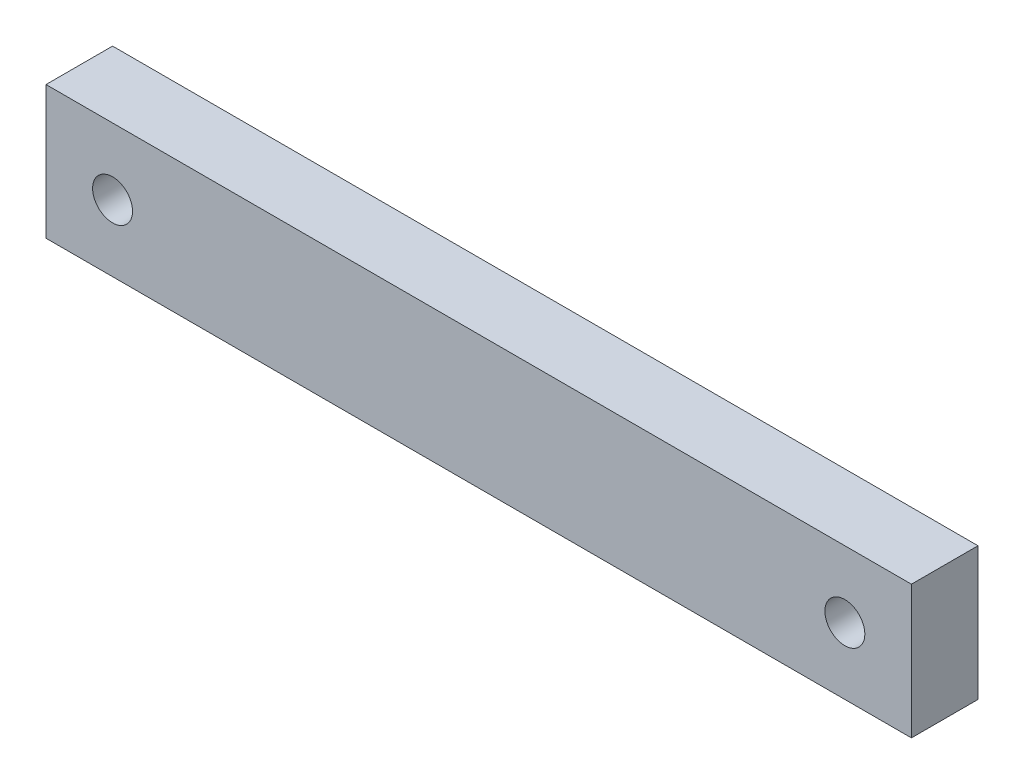
ISO-10303-21;
HEADER;
FILE_DESCRIPTION(('STEP AP214'),'2;1');
FILE_NAME('part.step','',(''),(''),'','','');
FILE_SCHEMA(('AUTOMOTIVE_DESIGN { 1 0 10303 214 1 1 1 1 }'));
ENDSEC;
DATA;
#1=APPLICATION_CONTEXT('core data for automotive mechanical design processes');
#2=APPLICATION_PROTOCOL_DEFINITION('international standard','automotive_design',2000,#1);
#3=PRODUCT_CONTEXT('',#1,'mechanical');
#4=PRODUCT('Part','Part','',(#3));
#5=PRODUCT_RELATED_PRODUCT_CATEGORY('part','',(#4));
#6=PRODUCT_DEFINITION_FORMATION('','',#4);
#7=PRODUCT_DEFINITION_CONTEXT('part definition',#1,'design');
#8=PRODUCT_DEFINITION('design','',#6,#7);
#9=PRODUCT_DEFINITION_SHAPE('','',#8);
#10=(LENGTH_UNIT() NAMED_UNIT(*) SI_UNIT(.MILLI.,.METRE.));
#11=(NAMED_UNIT(*) PLANE_ANGLE_UNIT() SI_UNIT($,.RADIAN.));
#12=(NAMED_UNIT(*) SI_UNIT($,.STERADIAN.) SOLID_ANGLE_UNIT());
#13=UNCERTAINTY_MEASURE_WITH_UNIT(LENGTH_MEASURE(1.E-05),#10,'distance_accuracy_value','');
#14=(GEOMETRIC_REPRESENTATION_CONTEXT(3) GLOBAL_UNCERTAINTY_ASSIGNED_CONTEXT((#13)) GLOBAL_UNIT_ASSIGNED_CONTEXT((#10,
#11,#12)) REPRESENTATION_CONTEXT('',''));
#15=CARTESIAN_POINT('',(0.,0.,0.));
#16=DIRECTION('',(0.,0.,1.));
#17=DIRECTION('',(1.,0.,0.));
#18=AXIS2_PLACEMENT_3D('',#15,#16,#17);
#19=CARTESIAN_POINT('',(0.,0.,5.));
#20=DIRECTION('',(0.,0.,-1.));
#21=DIRECTION('',(-1.,0.,0.));
#22=AXIS2_PLACEMENT_3D('',#19,#20,#21);
#23=PLANE('',#22);
#24=DIRECTION('',(1.,0.,0.));
#25=VECTOR('',#24,1.);
#26=CARTESIAN_POINT('',(-32.5,-5.,5.));
#27=LINE('',#26,#25);
#28=CARTESIAN_POINT('',(-32.5,-5.,5.));
#29=VERTEX_POINT('',#28);
#30=CARTESIAN_POINT('',(32.5,-5.,5.));
#31=VERTEX_POINT('',#30);
#32=EDGE_CURVE('E116',#29,#31,#27,.T.);
#33=ORIENTED_EDGE('',*,*,#32,.T.);
#34=DIRECTION('',(0.,-1.,0.));
#35=VECTOR('',#34,1.);
#36=CARTESIAN_POINT('',(32.5,5.,5.));
#37=LINE('',#36,#35);
#38=CARTESIAN_POINT('',(32.5,5.,5.));
#39=VERTEX_POINT('',#38);
#40=EDGE_CURVE('E123',#39,#31,#37,.T.);
#41=ORIENTED_EDGE('',*,*,#40,.F.);
#42=DIRECTION('',(1.,0.,0.));
#43=VECTOR('',#42,1.);
#44=CARTESIAN_POINT('',(-32.5,5.,5.));
#45=LINE('',#44,#43);
#46=CARTESIAN_POINT('',(-32.5,5.,5.));
#47=VERTEX_POINT('',#46);
#48=EDGE_CURVE('E132',#47,#39,#45,.T.);
#49=ORIENTED_EDGE('',*,*,#48,.F.);
#50=DIRECTION('',(0.,-1.,0.));
#51=VECTOR('',#50,1.);
#52=CARTESIAN_POINT('',(-32.5,5.,5.));
#53=LINE('',#52,#51);
#54=EDGE_CURVE('E93',#47,#29,#53,.T.);
#55=ORIENTED_EDGE('',*,*,#54,.T.);
#56=EDGE_LOOP('',(#33,#41,#49,#55));
#57=FACE_BOUND('',#56,.T.);
#58=CARTESIAN_POINT('',(-27.5,0.,5.));
#59=DIRECTION('',(0.,0.,1.));
#60=DIRECTION('',(1.,0.,0.));
#61=AXIS2_PLACEMENT_3D('',#58,#59,#60);
#62=CIRCLE('',#61,1.5);
#63=CARTESIAN_POINT('',(-26.,0.,5.));
#64=VERTEX_POINT('',#63);
#65=EDGE_CURVE('E147',#64,#64,#62,.T.);
#66=ORIENTED_EDGE('',*,*,#65,.F.);
#67=EDGE_LOOP('',(#66));
#68=FACE_BOUND('',#67,.T.);
#69=CARTESIAN_POINT('',(27.5,0.,5.));
#70=DIRECTION('',(0.,0.,1.));
#71=DIRECTION('',(1.,0.,0.));
#72=AXIS2_PLACEMENT_3D('',#69,#70,#71);
#73=CIRCLE('',#72,1.5);
#74=CARTESIAN_POINT('',(29.,0.,5.));
#75=VERTEX_POINT('',#74);
#76=EDGE_CURVE('E171',#75,#75,#73,.T.);
#77=ORIENTED_EDGE('',*,*,#76,.F.);
#78=EDGE_LOOP('',(#77));
#79=FACE_BOUND('',#78,.T.);
#80=ADVANCED_FACE('F75',(#57,#68,#79),#23,.F.);
#81=CARTESIAN_POINT('',(0.,0.,0.));
#82=DIRECTION('',(0.,0.,-1.));
#83=DIRECTION('',(-1.,0.,0.));
#84=AXIS2_PLACEMENT_3D('',#81,#82,#83);
#85=PLANE('',#84);
#86=CARTESIAN_POINT('',(-27.5,0.,0.));
#87=DIRECTION('',(0.,0.,1.));
#88=DIRECTION('',(1.,0.,0.));
#89=AXIS2_PLACEMENT_3D('',#86,#87,#88);
#90=CIRCLE('',#89,1.5);
#91=CARTESIAN_POINT('',(-26.,0.,0.));
#92=VERTEX_POINT('',#91);
#93=EDGE_CURVE('E175',#92,#92,#90,.T.);
#94=ORIENTED_EDGE('',*,*,#93,.T.);
#95=EDGE_LOOP('',(#94));
#96=FACE_BOUND('',#95,.T.);
#97=DIRECTION('',(1.,0.,0.));
#98=VECTOR('',#97,1.);
#99=CARTESIAN_POINT('',(-32.5,-5.,0.));
#100=LINE('',#99,#98);
#101=CARTESIAN_POINT('',(-32.5,-5.,0.));
#102=VERTEX_POINT('',#101);
#103=CARTESIAN_POINT('',(32.5,-5.,0.));
#104=VERTEX_POINT('',#103);
#105=EDGE_CURVE('E143',#102,#104,#100,.T.);
#106=ORIENTED_EDGE('',*,*,#105,.F.);
#107=DIRECTION('',(0.,-1.,0.));
#108=VECTOR('',#107,1.);
#109=CARTESIAN_POINT('',(-32.5,5.,0.));
#110=LINE('',#109,#108);
#111=CARTESIAN_POINT('',(-32.5,5.,0.));
#112=VERTEX_POINT('',#111);
#113=EDGE_CURVE('E111',#112,#102,#110,.T.);
#114=ORIENTED_EDGE('',*,*,#113,.F.);
#115=DIRECTION('',(1.,0.,0.));
#116=VECTOR('',#115,1.);
#117=CARTESIAN_POINT('',(-32.5,5.,0.));
#118=LINE('',#117,#116);
#119=CARTESIAN_POINT('',(32.5,5.,0.));
#120=VERTEX_POINT('',#119);
#121=EDGE_CURVE('E150',#112,#120,#118,.T.);
#122=ORIENTED_EDGE('',*,*,#121,.T.);
#123=DIRECTION('',(0.,-1.,0.));
#124=VECTOR('',#123,1.);
#125=CARTESIAN_POINT('',(32.5,5.,0.));
#126=LINE('',#125,#124);
#127=EDGE_CURVE('E125',#120,#104,#126,.T.);
#128=ORIENTED_EDGE('',*,*,#127,.T.);
#129=EDGE_LOOP('',(#106,#114,#122,#128));
#130=FACE_BOUND('',#129,.T.);
#131=CARTESIAN_POINT('',(27.5,0.,0.));
#132=DIRECTION('',(0.,0.,1.));
#133=DIRECTION('',(1.,0.,0.));
#134=AXIS2_PLACEMENT_3D('',#131,#132,#133);
#135=CIRCLE('',#134,1.5);
#136=CARTESIAN_POINT('',(29.,0.,0.));
#137=VERTEX_POINT('',#136);
#138=EDGE_CURVE('E168',#137,#137,#135,.T.);
#139=ORIENTED_EDGE('',*,*,#138,.T.);
#140=EDGE_LOOP('',(#139));
#141=FACE_BOUND('',#140,.T.);
#142=ADVANCED_FACE('F161',(#96,#130,#141),#85,.T.);
#143=CARTESIAN_POINT('',(-32.5,-5.,5.));
#144=DIRECTION('',(0.,1.,0.));
#145=DIRECTION('',(0.,0.,1.));
#146=AXIS2_PLACEMENT_3D('',#143,#144,#145);
#147=PLANE('',#146);
#148=ORIENTED_EDGE('',*,*,#105,.T.);
#149=DIRECTION('',(0.,0.,-1.));
#150=VECTOR('',#149,1.);
#151=CARTESIAN_POINT('',(32.5,-5.,5.));
#152=LINE('',#151,#150);
#153=EDGE_CURVE('E12',#31,#104,#152,.T.);
#154=ORIENTED_EDGE('',*,*,#153,.F.);
#155=ORIENTED_EDGE('',*,*,#32,.F.);
#156=DIRECTION('',(0.,0.,-1.));
#157=VECTOR('',#156,1.);
#158=CARTESIAN_POINT('',(-32.5,-5.,5.));
#159=LINE('',#158,#157);
#160=EDGE_CURVE('E139',#29,#102,#159,.T.);
#161=ORIENTED_EDGE('',*,*,#160,.T.);
#162=EDGE_LOOP('',(#148,#154,#155,#161));
#163=FACE_BOUND('',#162,.T.);
#164=ADVANCED_FACE('F77',(#163),#147,.F.);
#165=CARTESIAN_POINT('',(32.5,5.,5.));
#166=DIRECTION('',(1.,0.,0.));
#167=DIRECTION('',(0.,0.,-1.));
#168=AXIS2_PLACEMENT_3D('',#165,#166,#167);
#169=PLANE('',#168);
#170=ORIENTED_EDGE('',*,*,#127,.F.);
#171=DIRECTION('',(0.,0.,-1.));
#172=VECTOR('',#171,1.);
#173=CARTESIAN_POINT('',(32.5,5.,5.));
#174=LINE('',#173,#172);
#175=EDGE_CURVE('E85',#39,#120,#174,.T.);
#176=ORIENTED_EDGE('',*,*,#175,.F.);
#177=ORIENTED_EDGE('',*,*,#40,.T.);
#178=ORIENTED_EDGE('',*,*,#153,.T.);
#179=EDGE_LOOP('',(#170,#176,#177,#178));
#180=FACE_BOUND('',#179,.T.);
#181=ADVANCED_FACE('F122',(#180),#169,.T.);
#182=CARTESIAN_POINT('',(-32.5,5.,5.));
#183=DIRECTION('',(0.,1.,0.));
#184=DIRECTION('',(0.,0.,1.));
#185=AXIS2_PLACEMENT_3D('',#182,#183,#184);
#186=PLANE('',#185);
#187=ORIENTED_EDGE('',*,*,#121,.F.);
#188=DIRECTION('',(0.,0.,-1.));
#189=VECTOR('',#188,1.);
#190=CARTESIAN_POINT('',(-32.5,5.,5.));
#191=LINE('',#190,#189);
#192=EDGE_CURVE('E108',#47,#112,#191,.T.);
#193=ORIENTED_EDGE('',*,*,#192,.F.);
#194=ORIENTED_EDGE('',*,*,#48,.T.);
#195=ORIENTED_EDGE('',*,*,#175,.T.);
#196=EDGE_LOOP('',(#187,#193,#194,#195));
#197=FACE_BOUND('',#196,.T.);
#198=ADVANCED_FACE('F135',(#197),#186,.T.);
#199=CARTESIAN_POINT('',(-32.5,5.,5.));
#200=DIRECTION('',(1.,0.,0.));
#201=DIRECTION('',(0.,0.,-1.));
#202=AXIS2_PLACEMENT_3D('',#199,#200,#201);
#203=PLANE('',#202);
#204=ORIENTED_EDGE('',*,*,#113,.T.);
#205=ORIENTED_EDGE('',*,*,#160,.F.);
#206=ORIENTED_EDGE('',*,*,#54,.F.);
#207=ORIENTED_EDGE('',*,*,#192,.T.);
#208=EDGE_LOOP('',(#204,#205,#206,#207));
#209=FACE_BOUND('',#208,.T.);
#210=ADVANCED_FACE('F189',(#209),#203,.F.);
#211=CARTESIAN_POINT('',(-27.5,0.,5.));
#212=DIRECTION('',(0.,0.,-1.));
#213=DIRECTION('',(-1.,0.,0.));
#214=AXIS2_PLACEMENT_3D('',#211,#212,#213);
#215=CYLINDRICAL_SURFACE('',#214,1.5);
#216=ORIENTED_EDGE('',*,*,#65,.T.);
#217=EDGE_LOOP('',(#216));
#218=FACE_BOUND('',#217,.T.);
#219=ORIENTED_EDGE('',*,*,#93,.F.);
#220=EDGE_LOOP('',(#219));
#221=FACE_BOUND('',#220,.T.);
#222=ADVANCED_FACE('F186',(#218,#221),#215,.F.);
#223=CARTESIAN_POINT('',(27.5,0.,5.));
#224=DIRECTION('',(0.,0.,-1.));
#225=DIRECTION('',(-1.,0.,0.));
#226=AXIS2_PLACEMENT_3D('',#223,#224,#225);
#227=CYLINDRICAL_SURFACE('',#226,1.5);
#228=ORIENTED_EDGE('',*,*,#76,.T.);
#229=EDGE_LOOP('',(#228));
#230=FACE_BOUND('',#229,.T.);
#231=ORIENTED_EDGE('',*,*,#138,.F.);
#232=EDGE_LOOP('',(#231));
#233=FACE_BOUND('',#232,.T.);
#234=ADVANCED_FACE('F188',(#230,#233),#227,.F.);
#235=CLOSED_SHELL('',(#80,#142,#164,#181,#198,#210,#222,#234));
#236=MANIFOLD_SOLID_BREP('B2',#235);
#237=ADVANCED_BREP_SHAPE_REPRESENTATION('',(#18,#236),#14);
#238=SHAPE_DEFINITION_REPRESENTATION(#9,#237);
ENDSEC;
END-ISO-10303-21;
